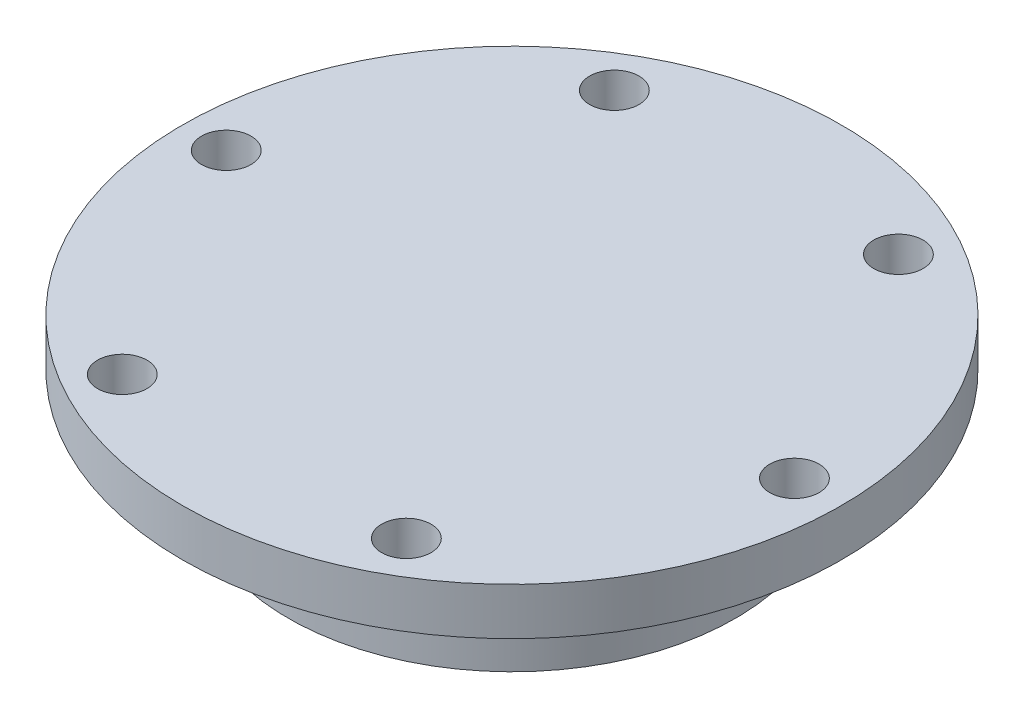
ISO-10303-21;
HEADER;
FILE_DESCRIPTION(('STEP AP214'),'2;1');
FILE_NAME('part.step','',(''),(''),'','','');
FILE_SCHEMA(('AUTOMOTIVE_DESIGN { 1 0 10303 214 1 1 1 1 }'));
ENDSEC;
DATA;
#1=APPLICATION_CONTEXT('core data for automotive mechanical design processes');
#2=APPLICATION_PROTOCOL_DEFINITION('international standard','automotive_design',2000,#1);
#3=PRODUCT_CONTEXT('',#1,'mechanical');
#4=PRODUCT('Part','Part','',(#3));
#5=PRODUCT_RELATED_PRODUCT_CATEGORY('part','',(#4));
#6=PRODUCT_DEFINITION_FORMATION('','',#4);
#7=PRODUCT_DEFINITION_CONTEXT('part definition',#1,'design');
#8=PRODUCT_DEFINITION('design','',#6,#7);
#9=PRODUCT_DEFINITION_SHAPE('','',#8);
#10=(LENGTH_UNIT() NAMED_UNIT(*) SI_UNIT(.MILLI.,.METRE.));
#11=(NAMED_UNIT(*) PLANE_ANGLE_UNIT() SI_UNIT($,.RADIAN.));
#12=(NAMED_UNIT(*) SI_UNIT($,.STERADIAN.) SOLID_ANGLE_UNIT());
#13=UNCERTAINTY_MEASURE_WITH_UNIT(LENGTH_MEASURE(1.E-05),#10,'distance_accuracy_value','');
#14=(GEOMETRIC_REPRESENTATION_CONTEXT(3) GLOBAL_UNCERTAINTY_ASSIGNED_CONTEXT((#13)) GLOBAL_UNIT_ASSIGNED_CONTEXT((#10,
#11,#12)) REPRESENTATION_CONTEXT('',''));
#15=CARTESIAN_POINT('',(0.,0.,0.));
#16=DIRECTION('',(0.,0.,1.));
#17=DIRECTION('',(1.,0.,0.));
#18=AXIS2_PLACEMENT_3D('',#15,#16,#17);
#19=CARTESIAN_POINT('',(0.,10.,0.));
#20=DIRECTION('',(0.,-1.,0.));
#21=DIRECTION('',(0.,0.,-1.));
#22=AXIS2_PLACEMENT_3D('',#19,#20,#21);
#23=CYLINDRICAL_SURFACE('',#22,70.);
#24=CARTESIAN_POINT('',(0.,10.,0.));
#25=DIRECTION('',(0.,1.,0.));
#26=DIRECTION('',(0.,0.,1.));
#27=AXIS2_PLACEMENT_3D('',#24,#25,#26);
#28=CIRCLE('',#27,70.);
#29=CARTESIAN_POINT('',(0.,10.,70.));
#30=VERTEX_POINT('',#29);
#31=EDGE_CURVE('E37',#30,#30,#28,.T.);
#32=ORIENTED_EDGE('',*,*,#31,.F.);
#33=EDGE_LOOP('',(#32));
#34=FACE_BOUND('',#33,.T.);
#35=CARTESIAN_POINT('',(0.,0.,0.));
#36=DIRECTION('',(0.,1.,0.));
#37=DIRECTION('',(0.,0.,1.));
#38=AXIS2_PLACEMENT_3D('',#35,#36,#37);
#39=CIRCLE('',#38,70.);
#40=CARTESIAN_POINT('',(0.,0.,70.));
#41=VERTEX_POINT('',#40);
#42=EDGE_CURVE('E42',#41,#41,#39,.T.);
#43=ORIENTED_EDGE('',*,*,#42,.T.);
#44=EDGE_LOOP('',(#43));
#45=FACE_BOUND('',#44,.T.);
#46=ADVANCED_FACE('F30',(#34,#45),#23,.T.);
#47=CARTESIAN_POINT('',(0.,10.,0.));
#48=DIRECTION('',(0.,1.,0.));
#49=DIRECTION('',(0.,0.,1.));
#50=AXIS2_PLACEMENT_3D('',#47,#48,#49);
#51=PLANE('',#50);
#52=CARTESIAN_POINT('',(29.8302954116914,10.,52.2554611962951));
#53=DIRECTION('',(0.,1.,0.));
#54=DIRECTION('',(0.,0.,1.));
#55=AXIS2_PLACEMENT_3D('',#52,#53,#54);
#56=CIRCLE('',#55,5.25);
#57=CARTESIAN_POINT('',(29.8302954116914,10.,57.5054611962951));
#58=VERTEX_POINT('',#57);
#59=EDGE_CURVE('E68',#58,#58,#56,.T.);
#60=ORIENTED_EDGE('',*,*,#59,.F.);
#61=EDGE_LOOP('',(#60));
#62=FACE_BOUND('',#61,.T.);
#63=CARTESIAN_POINT('',(-30.5091137649272,10.,52.2554611962958));
#64=DIRECTION('',(0.,1.,0.));
#65=DIRECTION('',(0.,0.,1.));
#66=AXIS2_PLACEMENT_3D('',#63,#64,#65);
#67=CIRCLE('',#66,5.25);
#68=CARTESIAN_POINT('',(-30.5091137649272,10.,57.5054611962958));
#69=VERTEX_POINT('',#68);
#70=EDGE_CURVE('E57',#69,#69,#67,.T.);
#71=ORIENTED_EDGE('',*,*,#70,.F.);
#72=EDGE_LOOP('',(#71));
#73=FACE_BOUND('',#72,.T.);
#74=CARTESIAN_POINT('',(-60.678818353237,10.,0.));
#75=DIRECTION('',(0.,1.,0.));
#76=DIRECTION('',(0.,0.,1.));
#77=AXIS2_PLACEMENT_3D('',#74,#75,#76);
#78=CIRCLE('',#77,5.25);
#79=CARTESIAN_POINT('',(-60.678818353237,10.,5.25000000000003));
#80=VERTEX_POINT('',#79);
#81=EDGE_CURVE('E56',#80,#80,#78,.T.);
#82=ORIENTED_EDGE('',*,*,#81,.F.);
#83=EDGE_LOOP('',(#82));
#84=FACE_BOUND('',#83,.T.);
#85=CARTESIAN_POINT('',(-30.509113764928,10.,-52.2554611962953));
#86=DIRECTION('',(0.,1.,0.));
#87=DIRECTION('',(0.,0.,1.));
#88=AXIS2_PLACEMENT_3D('',#85,#86,#87);
#89=CIRCLE('',#88,5.25);
#90=CARTESIAN_POINT('',(-30.509113764928,10.,-47.0054611962953));
#91=VERTEX_POINT('',#90);
#92=EDGE_CURVE('E53',#91,#91,#89,.T.);
#93=ORIENTED_EDGE('',*,*,#92,.F.);
#94=EDGE_LOOP('',(#93));
#95=FACE_BOUND('',#94,.T.);
#96=CARTESIAN_POINT('',(29.8302954116906,10.,-52.2554611962955));
#97=DIRECTION('',(0.,1.,0.));
#98=DIRECTION('',(0.,0.,1.));
#99=AXIS2_PLACEMENT_3D('',#96,#97,#98);
#100=CIRCLE('',#99,5.25);
#101=CARTESIAN_POINT('',(29.8302954116906,10.,-47.0054611962955));
#102=VERTEX_POINT('',#101);
#103=EDGE_CURVE('E52',#102,#102,#100,.T.);
#104=ORIENTED_EDGE('',*,*,#103,.F.);
#105=EDGE_LOOP('',(#104));
#106=FACE_BOUND('',#105,.T.);
#107=CARTESIAN_POINT('',(60.,10.,0.));
#108=DIRECTION('',(0.,1.,0.));
#109=DIRECTION('',(0.,0.,1.));
#110=AXIS2_PLACEMENT_3D('',#107,#108,#109);
#111=CIRCLE('',#110,5.25);
#112=CARTESIAN_POINT('',(60.,10.,5.25));
#113=VERTEX_POINT('',#112);
#114=EDGE_CURVE('E80',#113,#113,#111,.T.);
#115=ORIENTED_EDGE('',*,*,#114,.F.);
#116=EDGE_LOOP('',(#115));
#117=FACE_BOUND('',#116,.T.);
#118=ORIENTED_EDGE('',*,*,#31,.T.);
#119=EDGE_LOOP('',(#118));
#120=FACE_BOUND('',#119,.T.);
#121=ADVANCED_FACE('F101',(#62,#73,#84,#95,#106,#117,#120),#51,.T.);
#122=CARTESIAN_POINT('',(0.,0.,0.));
#123=DIRECTION('',(0.,1.,0.));
#124=DIRECTION('',(0.,0.,1.));
#125=AXIS2_PLACEMENT_3D('',#122,#123,#124);
#126=PLANE('',#125);
#127=CARTESIAN_POINT('',(29.8302954116914,0.,52.2554611962951));
#128=DIRECTION('',(0.,1.,0.));
#129=DIRECTION('',(0.,0.,1.));
#130=AXIS2_PLACEMENT_3D('',#127,#128,#129);
#131=CIRCLE('',#130,5.25);
#132=CARTESIAN_POINT('',(29.8302954116914,0.,57.5054611962951));
#133=VERTEX_POINT('',#132);
#134=EDGE_CURVE('E33',#133,#133,#131,.T.);
#135=ORIENTED_EDGE('',*,*,#134,.T.);
#136=EDGE_LOOP('',(#135));
#137=FACE_BOUND('',#136,.T.);
#138=CARTESIAN_POINT('',(-30.5091137649272,0.,52.2554611962958));
#139=DIRECTION('',(0.,1.,0.));
#140=DIRECTION('',(0.,0.,1.));
#141=AXIS2_PLACEMENT_3D('',#138,#139,#140);
#142=CIRCLE('',#141,5.25);
#143=CARTESIAN_POINT('',(-30.5091137649272,0.,57.5054611962958));
#144=VERTEX_POINT('',#143);
#145=EDGE_CURVE('E54',#144,#144,#142,.T.);
#146=ORIENTED_EDGE('',*,*,#145,.T.);
#147=EDGE_LOOP('',(#146));
#148=FACE_BOUND('',#147,.T.);
#149=CARTESIAN_POINT('',(-60.678818353237,0.,0.));
#150=DIRECTION('',(0.,1.,0.));
#151=DIRECTION('',(0.,0.,1.));
#152=AXIS2_PLACEMENT_3D('',#149,#150,#151);
#153=CIRCLE('',#152,5.25);
#154=CARTESIAN_POINT('',(-60.678818353237,0.,5.25000000000003));
#155=VERTEX_POINT('',#154);
#156=EDGE_CURVE('E61',#155,#155,#153,.T.);
#157=ORIENTED_EDGE('',*,*,#156,.T.);
#158=EDGE_LOOP('',(#157));
#159=FACE_BOUND('',#158,.T.);
#160=CARTESIAN_POINT('',(-30.509113764928,0.,-52.2554611962953));
#161=DIRECTION('',(0.,1.,0.));
#162=DIRECTION('',(0.,0.,1.));
#163=AXIS2_PLACEMENT_3D('',#160,#161,#162);
#164=CIRCLE('',#163,5.25);
#165=CARTESIAN_POINT('',(-30.509113764928,0.,-47.0054611962953));
#166=VERTEX_POINT('',#165);
#167=EDGE_CURVE('E50',#166,#166,#164,.T.);
#168=ORIENTED_EDGE('',*,*,#167,.T.);
#169=EDGE_LOOP('',(#168));
#170=FACE_BOUND('',#169,.T.);
#171=CARTESIAN_POINT('',(29.8302954116906,0.,-52.2554611962955));
#172=DIRECTION('',(0.,1.,0.));
#173=DIRECTION('',(0.,0.,1.));
#174=AXIS2_PLACEMENT_3D('',#171,#172,#173);
#175=CIRCLE('',#174,5.25);
#176=CARTESIAN_POINT('',(29.8302954116906,0.,-47.0054611962955));
#177=VERTEX_POINT('',#176);
#178=EDGE_CURVE('E77',#177,#177,#175,.T.);
#179=ORIENTED_EDGE('',*,*,#178,.T.);
#180=EDGE_LOOP('',(#179));
#181=FACE_BOUND('',#180,.T.);
#182=CARTESIAN_POINT('',(60.,0.,0.));
#183=DIRECTION('',(0.,1.,0.));
#184=DIRECTION('',(0.,0.,1.));
#185=AXIS2_PLACEMENT_3D('',#182,#183,#184);
#186=CIRCLE('',#185,5.25);
#187=CARTESIAN_POINT('',(60.,0.,5.25));
#188=VERTEX_POINT('',#187);
#189=EDGE_CURVE('E82',#188,#188,#186,.T.);
#190=ORIENTED_EDGE('',*,*,#189,.T.);
#191=EDGE_LOOP('',(#190));
#192=FACE_BOUND('',#191,.T.);
#193=CARTESIAN_POINT('',(0.,0.,0.));
#194=DIRECTION('',(0.,-1.,0.));
#195=DIRECTION('',(0.,0.,-1.));
#196=AXIS2_PLACEMENT_3D('',#193,#194,#195);
#197=CIRCLE('',#196,47.5);
#198=CARTESIAN_POINT('',(0.,0.,-47.5));
#199=VERTEX_POINT('',#198);
#200=EDGE_CURVE('E10',#199,#199,#197,.T.);
#201=ORIENTED_EDGE('',*,*,#200,.F.);
#202=EDGE_LOOP('',(#201));
#203=FACE_BOUND('',#202,.T.);
#204=ORIENTED_EDGE('',*,*,#42,.F.);
#205=EDGE_LOOP('',(#204));
#206=FACE_BOUND('',#205,.T.);
#207=ADVANCED_FACE('F93',(#137,#148,#159,#170,#181,#192,#203,#206),#126,.F.);
#208=CARTESIAN_POINT('',(0.,-22.,0.));
#209=DIRECTION('',(0.,1.,0.));
#210=DIRECTION('',(0.,0.,1.));
#211=AXIS2_PLACEMENT_3D('',#208,#209,#210);
#212=CYLINDRICAL_SURFACE('',#211,47.5);
#213=CARTESIAN_POINT('',(0.,-22.,0.));
#214=DIRECTION('',(0.,-1.,0.));
#215=DIRECTION('',(0.,0.,-1.));
#216=AXIS2_PLACEMENT_3D('',#213,#214,#215);
#217=CIRCLE('',#216,47.5);
#218=CARTESIAN_POINT('',(0.,-22.,-47.5));
#219=VERTEX_POINT('',#218);
#220=EDGE_CURVE('E45',#219,#219,#217,.T.);
#221=ORIENTED_EDGE('',*,*,#220,.F.);
#222=EDGE_LOOP('',(#221));
#223=FACE_BOUND('',#222,.T.);
#224=ORIENTED_EDGE('',*,*,#200,.T.);
#225=EDGE_LOOP('',(#224));
#226=FACE_BOUND('',#225,.T.);
#227=ADVANCED_FACE('F91',(#223,#226),#212,.T.);
#228=CARTESIAN_POINT('',(0.,-22.,0.));
#229=DIRECTION('',(0.,-1.,0.));
#230=DIRECTION('',(0.,0.,-1.));
#231=AXIS2_PLACEMENT_3D('',#228,#229,#230);
#232=PLANE('',#231);
#233=ORIENTED_EDGE('',*,*,#220,.T.);
#234=EDGE_LOOP('',(#233));
#235=FACE_BOUND('',#234,.T.);
#236=ADVANCED_FACE('F89',(#235),#232,.T.);
#237=CARTESIAN_POINT('',(60.,10.,0.));
#238=DIRECTION('',(0.,1.,0.));
#239=DIRECTION('',(0.,0.,1.));
#240=AXIS2_PLACEMENT_3D('',#237,#238,#239);
#241=CYLINDRICAL_SURFACE('',#240,5.25);
#242=ORIENTED_EDGE('',*,*,#114,.T.);
#243=EDGE_LOOP('',(#242));
#244=FACE_BOUND('',#243,.T.);
#245=ORIENTED_EDGE('',*,*,#189,.F.);
#246=EDGE_LOOP('',(#245));
#247=FACE_BOUND('',#246,.T.);
#248=ADVANCED_FACE('F99',(#244,#247),#241,.F.);
#249=CARTESIAN_POINT('',(29.8302954116906,10.,-52.2554611962955));
#250=DIRECTION('',(0.,1.,0.));
#251=DIRECTION('',(0.,0.,1.));
#252=AXIS2_PLACEMENT_3D('',#249,#250,#251);
#253=CYLINDRICAL_SURFACE('',#252,5.25);
#254=ORIENTED_EDGE('',*,*,#103,.T.);
#255=EDGE_LOOP('',(#254));
#256=FACE_BOUND('',#255,.T.);
#257=ORIENTED_EDGE('',*,*,#178,.F.);
#258=EDGE_LOOP('',(#257));
#259=FACE_BOUND('',#258,.T.);
#260=ADVANCED_FACE('F131',(#256,#259),#253,.F.);
#261=CARTESIAN_POINT('',(-30.509113764928,10.,-52.2554611962953));
#262=DIRECTION('',(0.,1.,0.));
#263=DIRECTION('',(0.,0.,1.));
#264=AXIS2_PLACEMENT_3D('',#261,#262,#263);
#265=CYLINDRICAL_SURFACE('',#264,5.25);
#266=ORIENTED_EDGE('',*,*,#92,.T.);
#267=EDGE_LOOP('',(#266));
#268=FACE_BOUND('',#267,.T.);
#269=ORIENTED_EDGE('',*,*,#167,.F.);
#270=EDGE_LOOP('',(#269));
#271=FACE_BOUND('',#270,.T.);
#272=ADVANCED_FACE('F136',(#268,#271),#265,.F.);
#273=CARTESIAN_POINT('',(-60.678818353237,10.,0.));
#274=DIRECTION('',(0.,1.,0.));
#275=DIRECTION('',(0.,0.,1.));
#276=AXIS2_PLACEMENT_3D('',#273,#274,#275);
#277=CYLINDRICAL_SURFACE('',#276,5.25);
#278=ORIENTED_EDGE('',*,*,#81,.T.);
#279=EDGE_LOOP('',(#278));
#280=FACE_BOUND('',#279,.T.);
#281=ORIENTED_EDGE('',*,*,#156,.F.);
#282=EDGE_LOOP('',(#281));
#283=FACE_BOUND('',#282,.T.);
#284=ADVANCED_FACE('F142',(#280,#283),#277,.F.);
#285=CARTESIAN_POINT('',(-30.5091137649272,10.,52.2554611962958));
#286=DIRECTION('',(0.,1.,0.));
#287=DIRECTION('',(0.,0.,1.));
#288=AXIS2_PLACEMENT_3D('',#285,#286,#287);
#289=CYLINDRICAL_SURFACE('',#288,5.25);
#290=ORIENTED_EDGE('',*,*,#70,.T.);
#291=EDGE_LOOP('',(#290));
#292=FACE_BOUND('',#291,.T.);
#293=ORIENTED_EDGE('',*,*,#145,.F.);
#294=EDGE_LOOP('',(#293));
#295=FACE_BOUND('',#294,.T.);
#296=ADVANCED_FACE('F146',(#292,#295),#289,.F.);
#297=CARTESIAN_POINT('',(29.8302954116914,10.,52.2554611962951));
#298=DIRECTION('',(0.,1.,0.));
#299=DIRECTION('',(0.,0.,1.));
#300=AXIS2_PLACEMENT_3D('',#297,#298,#299);
#301=CYLINDRICAL_SURFACE('',#300,5.25);
#302=ORIENTED_EDGE('',*,*,#59,.T.);
#303=EDGE_LOOP('',(#302));
#304=FACE_BOUND('',#303,.T.);
#305=ORIENTED_EDGE('',*,*,#134,.F.);
#306=EDGE_LOOP('',(#305));
#307=FACE_BOUND('',#306,.T.);
#308=ADVANCED_FACE('F150',(#304,#307),#301,.F.);
#309=CLOSED_SHELL('',(#46,#121,#207,#227,#236,#248,#260,#272,#284,#296,#308));
#310=MANIFOLD_SOLID_BREP('B2',#309);
#311=ADVANCED_BREP_SHAPE_REPRESENTATION('',(#18,#310),#14);
#312=SHAPE_DEFINITION_REPRESENTATION(#9,#311);
ENDSEC;
END-ISO-10303-21;
